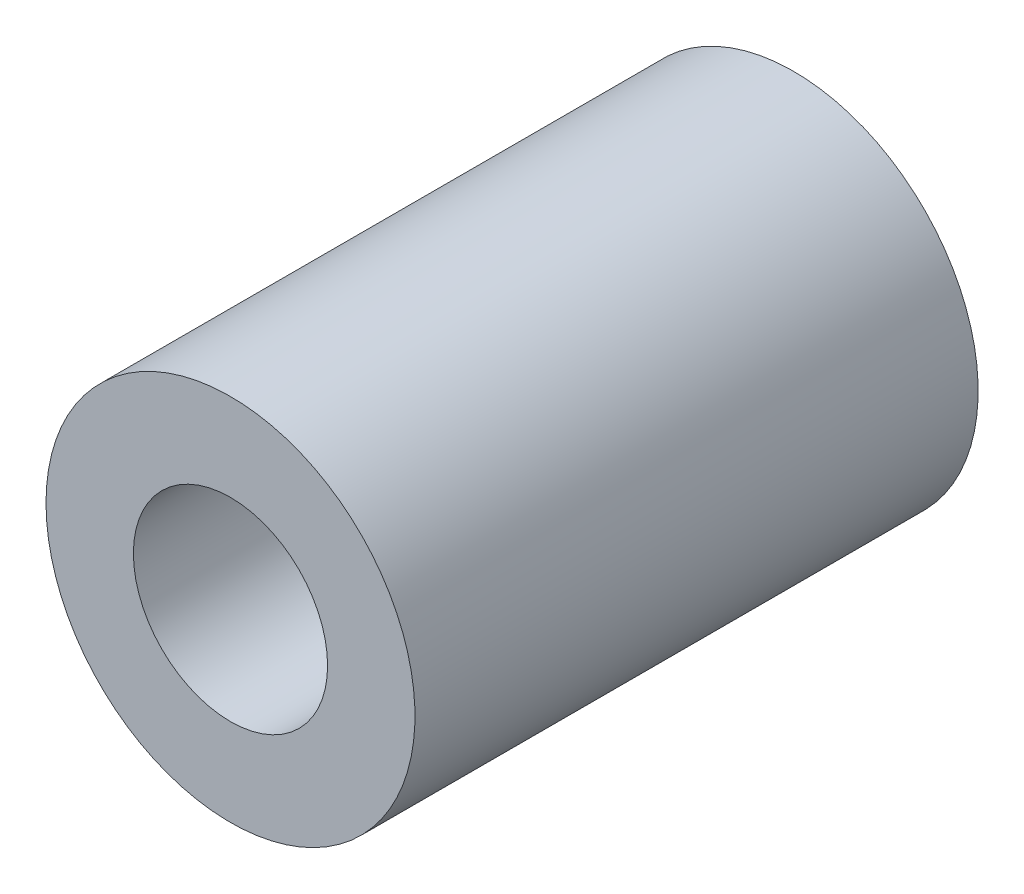
ISO-10303-21;
HEADER;
FILE_DESCRIPTION(('STEP AP214'),'2;1');
FILE_NAME('part.step','',(''),(''),'','','');
FILE_SCHEMA(('AUTOMOTIVE_DESIGN { 1 0 10303 214 1 1 1 1 }'));
ENDSEC;
DATA;
#1=APPLICATION_CONTEXT('core data for automotive mechanical design processes');
#2=APPLICATION_PROTOCOL_DEFINITION('international standard','automotive_design',2000,#1);
#3=PRODUCT_CONTEXT('',#1,'mechanical');
#4=PRODUCT('Part','Part','',(#3));
#5=PRODUCT_RELATED_PRODUCT_CATEGORY('part','',(#4));
#6=PRODUCT_DEFINITION_FORMATION('','',#4);
#7=PRODUCT_DEFINITION_CONTEXT('part definition',#1,'design');
#8=PRODUCT_DEFINITION('design','',#6,#7);
#9=PRODUCT_DEFINITION_SHAPE('','',#8);
#10=(LENGTH_UNIT() NAMED_UNIT(*) SI_UNIT(.MILLI.,.METRE.));
#11=(NAMED_UNIT(*) PLANE_ANGLE_UNIT() SI_UNIT($,.RADIAN.));
#12=(NAMED_UNIT(*) SI_UNIT($,.STERADIAN.) SOLID_ANGLE_UNIT());
#13=UNCERTAINTY_MEASURE_WITH_UNIT(LENGTH_MEASURE(1.E-05),#10,'distance_accuracy_value','');
#14=(GEOMETRIC_REPRESENTATION_CONTEXT(3) GLOBAL_UNCERTAINTY_ASSIGNED_CONTEXT((#13)) GLOBAL_UNIT_ASSIGNED_CONTEXT((#10,
#11,#12)) REPRESENTATION_CONTEXT('',''));
#15=CARTESIAN_POINT('',(0.,0.,0.));
#16=DIRECTION('',(0.,0.,1.));
#17=DIRECTION('',(1.,0.,0.));
#18=AXIS2_PLACEMENT_3D('',#15,#16,#17);
#19=CARTESIAN_POINT('',(0.,0.,14.5));
#20=DIRECTION('',(0.,0.,1.));
#21=DIRECTION('',(1.,0.,0.));
#22=AXIS2_PLACEMENT_3D('',#19,#20,#21);
#23=PLANE('',#22);
#24=CARTESIAN_POINT('',(0.,0.,14.5));
#25=DIRECTION('',(0.,0.,1.));
#26=DIRECTION('',(1.,0.,0.));
#27=AXIS2_PLACEMENT_3D('',#24,#25,#26);
#28=CIRCLE('',#27,9.5);
#29=CARTESIAN_POINT('',(-9.5,0.,14.5));
#30=VERTEX_POINT('',#29);
#31=EDGE_CURVE('E10',#30,#30,#28,.T.);
#32=ORIENTED_EDGE('',*,*,#31,.T.);
#33=EDGE_LOOP('',(#32));
#34=FACE_BOUND('',#33,.T.);
#35=CARTESIAN_POINT('',(0.,0.,14.5));
#36=DIRECTION('',(0.,0.,1.));
#37=DIRECTION('',(1.,0.,0.));
#38=AXIS2_PLACEMENT_3D('',#35,#36,#37);
#39=CIRCLE('',#38,5.);
#40=CARTESIAN_POINT('',(-5.,0.,14.5));
#41=VERTEX_POINT('',#40);
#42=EDGE_CURVE('E42',#41,#41,#39,.T.);
#43=ORIENTED_EDGE('',*,*,#42,.F.);
#44=EDGE_LOOP('',(#43));
#45=FACE_BOUND('',#44,.T.);
#46=ADVANCED_FACE('F31',(#34,#45),#23,.T.);
#47=CARTESIAN_POINT('',(0.,0.,-14.5));
#48=DIRECTION('',(0.,0.,1.));
#49=DIRECTION('',(1.,0.,0.));
#50=AXIS2_PLACEMENT_3D('',#47,#48,#49);
#51=PLANE('',#50);
#52=CARTESIAN_POINT('',(0.,0.,-14.5));
#53=DIRECTION('',(0.,0.,1.));
#54=DIRECTION('',(1.,0.,0.));
#55=AXIS2_PLACEMENT_3D('',#52,#53,#54);
#56=CIRCLE('',#55,9.5);
#57=CARTESIAN_POINT('',(-9.5,0.,-14.5));
#58=VERTEX_POINT('',#57);
#59=EDGE_CURVE('E35',#58,#58,#56,.T.);
#60=ORIENTED_EDGE('',*,*,#59,.F.);
#61=EDGE_LOOP('',(#60));
#62=FACE_BOUND('',#61,.T.);
#63=CARTESIAN_POINT('',(0.,0.,-14.5));
#64=DIRECTION('',(0.,0.,1.));
#65=DIRECTION('',(1.,0.,0.));
#66=AXIS2_PLACEMENT_3D('',#63,#64,#65);
#67=CIRCLE('',#66,5.);
#68=CARTESIAN_POINT('',(-5.,0.,-14.5));
#69=VERTEX_POINT('',#68);
#70=EDGE_CURVE('E44',#69,#69,#67,.T.);
#71=ORIENTED_EDGE('',*,*,#70,.T.);
#72=EDGE_LOOP('',(#71));
#73=FACE_BOUND('',#72,.T.);
#74=ADVANCED_FACE('F54',(#62,#73),#51,.F.);
#75=CARTESIAN_POINT('',(0.,0.,14.5));
#76=DIRECTION('',(0.,0.,-1.));
#77=DIRECTION('',(-1.,0.,0.));
#78=AXIS2_PLACEMENT_3D('',#75,#76,#77);
#79=CYLINDRICAL_SURFACE('',#78,9.5);
#80=CARTESIAN_POINT('',(-9.5,0.,14.5));
#81=CARTESIAN_POINT('',(-9.5,0.,14.1979166666667));
#82=CARTESIAN_POINT('',(-9.5,0.,13.8958333333333));
#83=CARTESIAN_POINT('',(-9.5,0.,13.2916666666667));
#84=CARTESIAN_POINT('',(-9.5,0.,12.9895833333333));
#85=CARTESIAN_POINT('',(-9.5,0.,12.3854166666667));
#86=CARTESIAN_POINT('',(-9.5,0.,12.0833333333333));
#87=CARTESIAN_POINT('',(-9.5,0.,11.4791666666667));
#88=CARTESIAN_POINT('',(-9.5,0.,11.1770833333333));
#89=CARTESIAN_POINT('',(-9.5,0.,10.5729166666667));
#90=CARTESIAN_POINT('',(-9.5,0.,10.2708333333333));
#91=CARTESIAN_POINT('',(-9.5,0.,9.66666666666667));
#92=CARTESIAN_POINT('',(-9.5,0.,9.36458333333333));
#93=CARTESIAN_POINT('',(-9.5,0.,8.76041666666667));
#94=CARTESIAN_POINT('',(-9.5,0.,8.45833333333333));
#95=CARTESIAN_POINT('',(-9.5,0.,7.85416666666667));
#96=CARTESIAN_POINT('',(-9.5,0.,7.55208333333333));
#97=CARTESIAN_POINT('',(-9.5,0.,6.94791666666667));
#98=CARTESIAN_POINT('',(-9.5,0.,6.64583333333333));
#99=CARTESIAN_POINT('',(-9.5,0.,6.04166666666667));
#100=CARTESIAN_POINT('',(-9.5,0.,5.73958333333333));
#101=CARTESIAN_POINT('',(-9.5,0.,5.13541666666667));
#102=CARTESIAN_POINT('',(-9.5,0.,4.83333333333333));
#103=CARTESIAN_POINT('',(-9.5,0.,4.22916666666667));
#104=CARTESIAN_POINT('',(-9.5,0.,3.92708333333333));
#105=CARTESIAN_POINT('',(-9.5,0.,3.32291666666667));
#106=CARTESIAN_POINT('',(-9.5,0.,3.02083333333333));
#107=CARTESIAN_POINT('',(-9.5,0.,2.41666666666667));
#108=CARTESIAN_POINT('',(-9.5,0.,2.11458333333333));
#109=CARTESIAN_POINT('',(-9.5,0.,1.51041666666667));
#110=CARTESIAN_POINT('',(-9.5,0.,1.20833333333333));
#111=CARTESIAN_POINT('',(-9.5,0.,0.604166666666667));
#112=CARTESIAN_POINT('',(-9.5,0.,0.302083333333334));
#113=CARTESIAN_POINT('',(-9.5,0.,-0.302083333333334));
#114=CARTESIAN_POINT('',(-9.5,0.,-0.604166666666667));
#115=CARTESIAN_POINT('',(-9.5,0.,-1.20833333333333));
#116=CARTESIAN_POINT('',(-9.5,0.,-1.51041666666667));
#117=CARTESIAN_POINT('',(-9.5,0.,-2.11458333333333));
#118=CARTESIAN_POINT('',(-9.5,0.,-2.41666666666667));
#119=CARTESIAN_POINT('',(-9.5,0.,-3.02083333333333));
#120=CARTESIAN_POINT('',(-9.5,0.,-3.32291666666666));
#121=CARTESIAN_POINT('',(-9.5,0.,-3.92708333333333));
#122=CARTESIAN_POINT('',(-9.5,0.,-4.22916666666667));
#123=CARTESIAN_POINT('',(-9.5,0.,-4.83333333333333));
#124=CARTESIAN_POINT('',(-9.5,0.,-5.13541666666667));
#125=CARTESIAN_POINT('',(-9.5,0.,-5.73958333333333));
#126=CARTESIAN_POINT('',(-9.5,0.,-6.04166666666667));
#127=CARTESIAN_POINT('',(-9.5,0.,-6.64583333333333));
#128=CARTESIAN_POINT('',(-9.5,0.,-6.94791666666667));
#129=CARTESIAN_POINT('',(-9.5,0.,-7.55208333333333));
#130=CARTESIAN_POINT('',(-9.5,0.,-7.85416666666667));
#131=CARTESIAN_POINT('',(-9.5,0.,-8.45833333333333));
#132=CARTESIAN_POINT('',(-9.5,0.,-8.76041666666667));
#133=CARTESIAN_POINT('',(-9.5,0.,-9.36458333333333));
#134=CARTESIAN_POINT('',(-9.5,0.,-9.66666666666667));
#135=CARTESIAN_POINT('',(-9.5,0.,-10.2708333333333));
#136=CARTESIAN_POINT('',(-9.5,0.,-10.5729166666667));
#137=CARTESIAN_POINT('',(-9.5,0.,-11.1770833333333));
#138=CARTESIAN_POINT('',(-9.5,0.,-11.4791666666667));
#139=CARTESIAN_POINT('',(-9.5,0.,-12.0833333333333));
#140=CARTESIAN_POINT('',(-9.5,0.,-12.3854166666667));
#141=CARTESIAN_POINT('',(-9.5,0.,-12.9895833333333));
#142=CARTESIAN_POINT('',(-9.5,0.,-13.2916666666667));
#143=CARTESIAN_POINT('',(-9.5,0.,-13.8958333333333));
#144=CARTESIAN_POINT('',(-9.5,0.,-14.1979166666667));
#145=CARTESIAN_POINT('',(-9.5,0.,-14.5));
#146=B_SPLINE_CURVE_WITH_KNOTS('',3,(#80,#81,#82,#83,#84,#85,#86,#87,#88,#89,#90,#91,#92,#93,
#94,#95,#96,#97,#98,#99,#100,#101,#102,#103,#104,#105,#106,#107,#108,#109,#110,#111,#112,#113,
#114,#115,#116,#117,#118,#119,#120,#121,#122,#123,#124,#125,#126,#127,#128,#129,#130,#131,#132,
#133,#134,#135,#136,#137,#138,#139,#140,#141,#142,#143,#144,#145),.UNSPECIFIED.,.F.,.F.,(4,2,2,
2,2,2,2,2,2,2,2,2,2,2,2,2,2,2,2,2,2,2,2,2,2,2,2,2,2,2,2,2,4),(0.,0.906250000000001,1.8125,
2.71875,3.625,4.53125,5.4375,6.34375,7.25,8.15625,9.0625,9.96875,10.875,11.78125,12.6875,
13.59375,14.5,15.40625,16.3125,17.21875,18.125,19.03125,19.9375,20.84375,21.75,22.65625,23.5625,
24.46875,25.375,26.28125,27.1875,28.09375,29.),.UNSPECIFIED.);
#147=EDGE_CURVE('BSEAM33',#30,#58,#146,.T.);
#148=ORIENTED_EDGE('',*,*,#31,.F.);
#149=ORIENTED_EDGE('',*,*,#59,.T.);
#150=ORIENTED_EDGE('',*,*,#147,.T.);
#151=ORIENTED_EDGE('',*,*,#147,.F.);
#152=EDGE_LOOP('',(#148,#150,#149,#151));
#153=FACE_BOUND('',#152,.T.);
#154=ADVANCED_FACE('F33',(#153),#79,.T.);
#155=CARTESIAN_POINT('',(0.,0.,14.5));
#156=DIRECTION('',(0.,0.,-1.));
#157=DIRECTION('',(-1.,0.,0.));
#158=AXIS2_PLACEMENT_3D('',#155,#156,#157);
#159=CYLINDRICAL_SURFACE('',#158,5.);
#160=CARTESIAN_POINT('',(-5.,0.,14.5));
#161=CARTESIAN_POINT('',(-5.,0.,14.1979166666667));
#162=CARTESIAN_POINT('',(-5.,0.,13.8958333333333));
#163=CARTESIAN_POINT('',(-5.,0.,13.2916666666667));
#164=CARTESIAN_POINT('',(-5.,0.,12.9895833333333));
#165=CARTESIAN_POINT('',(-5.,0.,12.3854166666667));
#166=CARTESIAN_POINT('',(-5.,0.,12.0833333333333));
#167=CARTESIAN_POINT('',(-5.,0.,11.4791666666667));
#168=CARTESIAN_POINT('',(-5.,0.,11.1770833333333));
#169=CARTESIAN_POINT('',(-5.,0.,10.5729166666667));
#170=CARTESIAN_POINT('',(-5.,0.,10.2708333333333));
#171=CARTESIAN_POINT('',(-5.,0.,9.66666666666667));
#172=CARTESIAN_POINT('',(-5.,0.,9.36458333333333));
#173=CARTESIAN_POINT('',(-5.,0.,8.76041666666667));
#174=CARTESIAN_POINT('',(-5.,0.,8.45833333333333));
#175=CARTESIAN_POINT('',(-5.,0.,7.85416666666667));
#176=CARTESIAN_POINT('',(-5.,0.,7.55208333333333));
#177=CARTESIAN_POINT('',(-5.,0.,6.94791666666667));
#178=CARTESIAN_POINT('',(-5.,0.,6.64583333333333));
#179=CARTESIAN_POINT('',(-5.,0.,6.04166666666667));
#180=CARTESIAN_POINT('',(-5.,0.,5.73958333333333));
#181=CARTESIAN_POINT('',(-5.,0.,5.13541666666667));
#182=CARTESIAN_POINT('',(-5.,0.,4.83333333333333));
#183=CARTESIAN_POINT('',(-5.,0.,4.22916666666667));
#184=CARTESIAN_POINT('',(-5.,0.,3.92708333333333));
#185=CARTESIAN_POINT('',(-5.,0.,3.32291666666667));
#186=CARTESIAN_POINT('',(-5.,0.,3.02083333333333));
#187=CARTESIAN_POINT('',(-5.,0.,2.41666666666667));
#188=CARTESIAN_POINT('',(-5.,0.,2.11458333333333));
#189=CARTESIAN_POINT('',(-5.,0.,1.51041666666667));
#190=CARTESIAN_POINT('',(-5.,0.,1.20833333333333));
#191=CARTESIAN_POINT('',(-5.,0.,0.604166666666665));
#192=CARTESIAN_POINT('',(-5.,0.,0.302083333333332));
#193=CARTESIAN_POINT('',(-5.,0.,-0.302083333333335));
#194=CARTESIAN_POINT('',(-5.,0.,-0.604166666666669));
#195=CARTESIAN_POINT('',(-5.,0.,-1.20833333333333));
#196=CARTESIAN_POINT('',(-5.,0.,-1.51041666666667));
#197=CARTESIAN_POINT('',(-5.,0.,-2.11458333333333));
#198=CARTESIAN_POINT('',(-5.,0.,-2.41666666666667));
#199=CARTESIAN_POINT('',(-5.,0.,-3.02083333333333));
#200=CARTESIAN_POINT('',(-5.,0.,-3.32291666666666));
#201=CARTESIAN_POINT('',(-5.,0.,-3.92708333333333));
#202=CARTESIAN_POINT('',(-5.,0.,-4.22916666666667));
#203=CARTESIAN_POINT('',(-5.,0.,-4.83333333333333));
#204=CARTESIAN_POINT('',(-5.,0.,-5.13541666666667));
#205=CARTESIAN_POINT('',(-5.,0.,-5.73958333333333));
#206=CARTESIAN_POINT('',(-5.,0.,-6.04166666666667));
#207=CARTESIAN_POINT('',(-5.,0.,-6.64583333333333));
#208=CARTESIAN_POINT('',(-5.,0.,-6.94791666666667));
#209=CARTESIAN_POINT('',(-5.,0.,-7.55208333333333));
#210=CARTESIAN_POINT('',(-5.,0.,-7.85416666666667));
#211=CARTESIAN_POINT('',(-5.,0.,-8.45833333333333));
#212=CARTESIAN_POINT('',(-5.,0.,-8.76041666666667));
#213=CARTESIAN_POINT('',(-5.,0.,-9.36458333333333));
#214=CARTESIAN_POINT('',(-5.,0.,-9.66666666666667));
#215=CARTESIAN_POINT('',(-5.,0.,-10.2708333333333));
#216=CARTESIAN_POINT('',(-5.,0.,-10.5729166666667));
#217=CARTESIAN_POINT('',(-5.,0.,-11.1770833333333));
#218=CARTESIAN_POINT('',(-5.,0.,-11.4791666666667));
#219=CARTESIAN_POINT('',(-5.,0.,-12.0833333333333));
#220=CARTESIAN_POINT('',(-5.,0.,-12.3854166666667));
#221=CARTESIAN_POINT('',(-5.,0.,-12.9895833333333));
#222=CARTESIAN_POINT('',(-5.,0.,-13.2916666666667));
#223=CARTESIAN_POINT('',(-5.,0.,-13.8958333333333));
#224=CARTESIAN_POINT('',(-5.,0.,-14.1979166666667));
#225=CARTESIAN_POINT('',(-5.,0.,-14.5));
#226=B_SPLINE_CURVE_WITH_KNOTS('',3,(#160,#161,#162,#163,#164,#165,#166,#167,#168,#169,#170,
#171,#172,#173,#174,#175,#176,#177,#178,#179,#180,#181,#182,#183,#184,#185,#186,#187,#188,#189,
#190,#191,#192,#193,#194,#195,#196,#197,#198,#199,#200,#201,#202,#203,#204,#205,#206,#207,#208,
#209,#210,#211,#212,#213,#214,#215,#216,#217,#218,#219,#220,#221,#222,#223,#224,#225),
.UNSPECIFIED.,.F.,.F.,(4,2,2,2,2,2,2,2,2,2,2,2,2,2,2,2,2,2,2,2,2,2,2,2,2,2,2,2,2,2,2,2,4),(0.,
0.906249999999999,1.8125,2.71875,3.625,4.53125,5.4375,6.34375,7.25,8.15625,9.0625,9.96875,
10.875,11.78125,12.6875,13.59375,14.5,15.40625,16.3125,17.21875,18.125,19.03125,19.9375,
20.84375,21.75,22.65625,23.5625,24.46875,25.375,26.28125,27.1875,28.09375,29.),.UNSPECIFIED.);
#227=EDGE_CURVE('BSEAM50',#41,#69,#226,.T.);
#228=ORIENTED_EDGE('',*,*,#42,.T.);
#229=ORIENTED_EDGE('',*,*,#70,.F.);
#230=ORIENTED_EDGE('',*,*,#227,.T.);
#231=ORIENTED_EDGE('',*,*,#227,.F.);
#232=EDGE_LOOP('',(#228,#230,#229,#231));
#233=FACE_BOUND('',#232,.T.);
#234=ADVANCED_FACE('F50',(#233),#159,.F.);
#235=CLOSED_SHELL('',(#46,#74,#154,#234));
#236=MANIFOLD_SOLID_BREP('B2',#235);
#237=ADVANCED_BREP_SHAPE_REPRESENTATION('',(#18,#236),#14);
#238=SHAPE_DEFINITION_REPRESENTATION(#9,#237);
ENDSEC;
END-ISO-10303-21;
